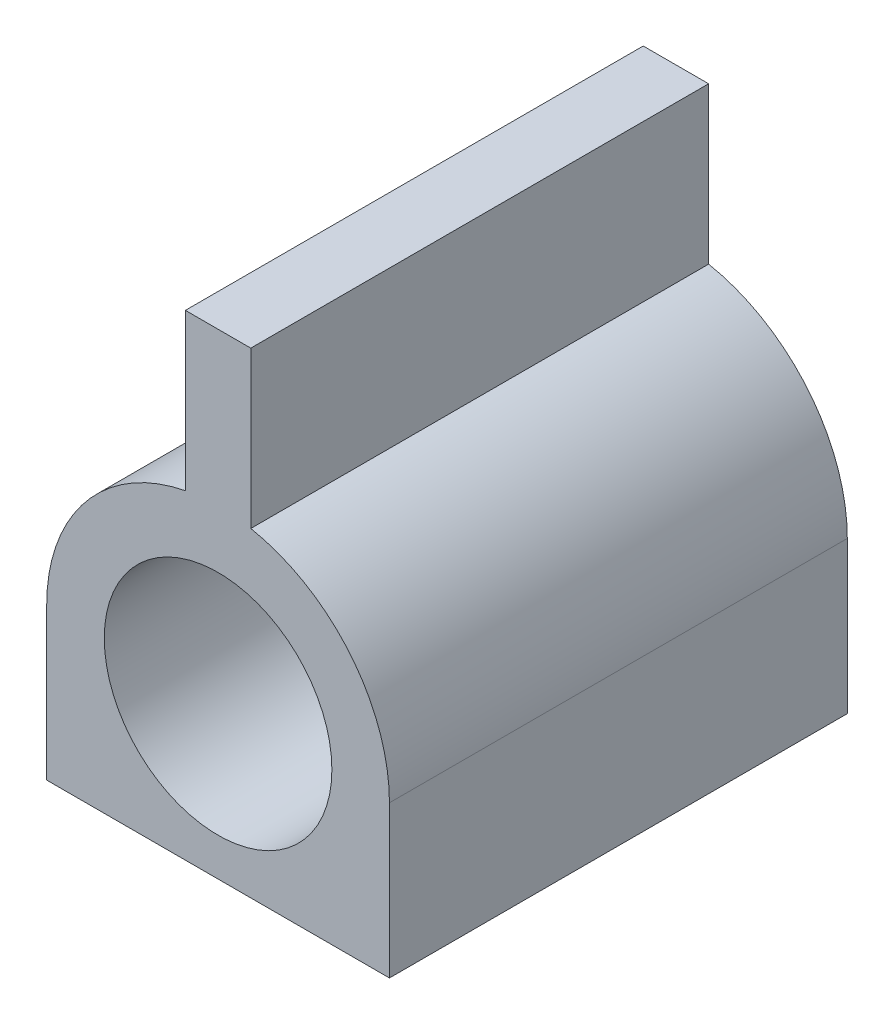
ISO-10303-21;
HEADER;
FILE_DESCRIPTION(('STEP AP214'),'2;1');
FILE_NAME('part.step','',(''),(''),'','','');
FILE_SCHEMA(('AUTOMOTIVE_DESIGN { 1 0 10303 214 1 1 1 1 }'));
ENDSEC;
DATA;
#1=APPLICATION_CONTEXT('core data for automotive mechanical design processes');
#2=APPLICATION_PROTOCOL_DEFINITION('international standard','automotive_design',2000,#1);
#3=PRODUCT_CONTEXT('',#1,'mechanical');
#4=PRODUCT('Part','Part','',(#3));
#5=PRODUCT_RELATED_PRODUCT_CATEGORY('part','',(#4));
#6=PRODUCT_DEFINITION_FORMATION('','',#4);
#7=PRODUCT_DEFINITION_CONTEXT('part definition',#1,'design');
#8=PRODUCT_DEFINITION('design','',#6,#7);
#9=PRODUCT_DEFINITION_SHAPE('','',#8);
#10=(LENGTH_UNIT() NAMED_UNIT(*) SI_UNIT(.MILLI.,.METRE.));
#11=(NAMED_UNIT(*) PLANE_ANGLE_UNIT() SI_UNIT($,.RADIAN.));
#12=(NAMED_UNIT(*) SI_UNIT($,.STERADIAN.) SOLID_ANGLE_UNIT());
#13=UNCERTAINTY_MEASURE_WITH_UNIT(LENGTH_MEASURE(1.E-05),#10,'distance_accuracy_value','');
#14=(GEOMETRIC_REPRESENTATION_CONTEXT(3) GLOBAL_UNCERTAINTY_ASSIGNED_CONTEXT((#13)) GLOBAL_UNIT_ASSIGNED_CONTEXT((#10,
#11,#12)) REPRESENTATION_CONTEXT('',''));
#15=CARTESIAN_POINT('',(0.,0.,0.));
#16=DIRECTION('',(0.,0.,1.));
#17=DIRECTION('',(1.,0.,0.));
#18=AXIS2_PLACEMENT_3D('',#15,#16,#17);
#19=CARTESIAN_POINT('',(0.,0.,22.225));
#20=DIRECTION('',(0.,0.,-1.));
#21=DIRECTION('',(-1.,0.,0.));
#22=AXIS2_PLACEMENT_3D('',#19,#20,#21);
#23=PLANE('',#22);
#24=DIRECTION('',(0.,-1.,0.));
#25=VECTOR('',#24,1.);
#26=CARTESIAN_POINT('',(-16.637,-14.732,22.225));
#27=LINE('',#26,#25);
#28=CARTESIAN_POINT('',(-16.637,0.,22.225));
#29=VERTEX_POINT('',#28);
#30=CARTESIAN_POINT('',(-16.637,-14.732,22.225));
#31=VERTEX_POINT('',#30);
#32=EDGE_CURVE('E146',#29,#31,#27,.T.);
#33=ORIENTED_EDGE('',*,*,#32,.T.);
#34=DIRECTION('',(1.,0.,0.));
#35=VECTOR('',#34,1.);
#36=CARTESIAN_POINT('',(16.637,-14.732,22.225));
#37=LINE('',#36,#35);
#38=CARTESIAN_POINT('',(16.637,-14.732,22.225));
#39=VERTEX_POINT('',#38);
#40=EDGE_CURVE('E94',#31,#39,#37,.T.);
#41=ORIENTED_EDGE('',*,*,#40,.T.);
#42=DIRECTION('',(0.,1.,0.));
#43=VECTOR('',#42,1.);
#44=CARTESIAN_POINT('',(16.637,0.,22.225));
#45=LINE('',#44,#43);
#46=CARTESIAN_POINT('',(16.637,0.,22.225));
#47=VERTEX_POINT('',#46);
#48=EDGE_CURVE('E161',#39,#47,#45,.T.);
#49=ORIENTED_EDGE('',*,*,#48,.T.);
#50=CARTESIAN_POINT('',(0.,0.,22.225));
#51=DIRECTION('',(0.,0.,1.));
#52=DIRECTION('',(-1.,0.,0.));
#53=AXIS2_PLACEMENT_3D('',#50,#51,#52);
#54=CIRCLE('',#53,16.637);
#55=CARTESIAN_POINT('',(3.175,16.3312321641694,22.225));
#56=VERTEX_POINT('',#55);
#57=EDGE_CURVE('E174',#47,#56,#54,.T.);
#58=ORIENTED_EDGE('',*,*,#57,.T.);
#59=DIRECTION('',(0.,1.,0.));
#60=VECTOR('',#59,1.);
#61=CARTESIAN_POINT('',(3.175,31.496,22.225));
#62=LINE('',#61,#60);
#63=CARTESIAN_POINT('',(3.175,31.496,22.225));
#64=VERTEX_POINT('',#63);
#65=EDGE_CURVE('E113',#56,#64,#62,.T.);
#66=ORIENTED_EDGE('',*,*,#65,.T.);
#67=DIRECTION('',(-1.,0.,0.));
#68=VECTOR('',#67,1.);
#69=CARTESIAN_POINT('',(-3.175,31.496,22.225));
#70=LINE('',#69,#68);
#71=CARTESIAN_POINT('',(-3.175,31.496,22.225));
#72=VERTEX_POINT('',#71);
#73=EDGE_CURVE('E107',#64,#72,#70,.T.);
#74=ORIENTED_EDGE('',*,*,#73,.T.);
#75=DIRECTION('',(0.,-1.,0.));
#76=VECTOR('',#75,1.);
#77=CARTESIAN_POINT('',(-3.175,16.3312321641694,22.225));
#78=LINE('',#77,#76);
#79=CARTESIAN_POINT('',(-3.175,16.3312321641694,22.225));
#80=VERTEX_POINT('',#79);
#81=EDGE_CURVE('E111',#72,#80,#78,.T.);
#82=ORIENTED_EDGE('',*,*,#81,.T.);
#83=CARTESIAN_POINT('',(0.,0.,22.225));
#84=DIRECTION('',(0.,0.,1.));
#85=DIRECTION('',(-1.,0.,0.));
#86=AXIS2_PLACEMENT_3D('',#83,#84,#85);
#87=CIRCLE('',#86,16.637);
#88=EDGE_CURVE('E51',#80,#29,#87,.T.);
#89=ORIENTED_EDGE('',*,*,#88,.T.);
#90=EDGE_LOOP('',(#33,#41,#49,#58,#66,#74,#82,#89));
#91=FACE_BOUND('',#90,.T.);
#92=CARTESIAN_POINT('',(0.,0.,22.225));
#93=DIRECTION('',(0.,0.,1.));
#94=DIRECTION('',(1.,0.,0.));
#95=AXIS2_PLACEMENT_3D('',#92,#93,#94);
#96=CIRCLE('',#95,11.049);
#97=CARTESIAN_POINT('',(11.049,0.,22.225));
#98=VERTEX_POINT('',#97);
#99=EDGE_CURVE('E135',#98,#98,#96,.T.);
#100=ORIENTED_EDGE('',*,*,#99,.F.);
#101=EDGE_LOOP('',(#100));
#102=FACE_BOUND('',#101,.T.);
#103=ADVANCED_FACE('F34',(#91,#102),#23,.F.);
#104=CARTESIAN_POINT('',(0.,0.,-22.225));
#105=DIRECTION('',(0.,0.,-1.));
#106=DIRECTION('',(-1.,0.,0.));
#107=AXIS2_PLACEMENT_3D('',#104,#105,#106);
#108=PLANE('',#107);
#109=DIRECTION('',(0.,-1.,0.));
#110=VECTOR('',#109,1.);
#111=CARTESIAN_POINT('',(-16.637,-14.732,-22.225));
#112=LINE('',#111,#110);
#113=CARTESIAN_POINT('',(-16.637,0.,-22.225));
#114=VERTEX_POINT('',#113);
#115=CARTESIAN_POINT('',(-16.637,-14.732,-22.225));
#116=VERTEX_POINT('',#115);
#117=EDGE_CURVE('E131',#114,#116,#112,.T.);
#118=ORIENTED_EDGE('',*,*,#117,.F.);
#119=CARTESIAN_POINT('',(0.,0.,-22.225));
#120=DIRECTION('',(0.,0.,1.));
#121=DIRECTION('',(-1.,0.,0.));
#122=AXIS2_PLACEMENT_3D('',#119,#120,#121);
#123=CIRCLE('',#122,16.637);
#124=CARTESIAN_POINT('',(-3.175,16.3312321641694,-22.225));
#125=VERTEX_POINT('',#124);
#126=EDGE_CURVE('E86',#125,#114,#123,.T.);
#127=ORIENTED_EDGE('',*,*,#126,.F.);
#128=DIRECTION('',(0.,-1.,0.));
#129=VECTOR('',#128,1.);
#130=CARTESIAN_POINT('',(-3.175,16.3312321641694,-22.225));
#131=LINE('',#130,#129);
#132=CARTESIAN_POINT('',(-3.175,31.496,-22.225));
#133=VERTEX_POINT('',#132);
#134=EDGE_CURVE('E80',#133,#125,#131,.T.);
#135=ORIENTED_EDGE('',*,*,#134,.F.);
#136=DIRECTION('',(-1.,0.,0.));
#137=VECTOR('',#136,1.);
#138=CARTESIAN_POINT('',(-3.175,31.496,-22.225));
#139=LINE('',#138,#137);
#140=CARTESIAN_POINT('',(3.175,31.496,-22.225));
#141=VERTEX_POINT('',#140);
#142=EDGE_CURVE('E121',#141,#133,#139,.T.);
#143=ORIENTED_EDGE('',*,*,#142,.F.);
#144=DIRECTION('',(0.,1.,0.));
#145=VECTOR('',#144,1.);
#146=CARTESIAN_POINT('',(3.175,31.496,-22.225));
#147=LINE('',#146,#145);
#148=CARTESIAN_POINT('',(3.175,16.3312321641694,-22.225));
#149=VERTEX_POINT('',#148);
#150=EDGE_CURVE('E141',#149,#141,#147,.T.);
#151=ORIENTED_EDGE('',*,*,#150,.F.);
#152=CARTESIAN_POINT('',(0.,0.,-22.225));
#153=DIRECTION('',(0.,0.,1.));
#154=DIRECTION('',(-1.,0.,0.));
#155=AXIS2_PLACEMENT_3D('',#152,#153,#154);
#156=CIRCLE('',#155,16.637);
#157=CARTESIAN_POINT('',(16.637,0.,-22.225));
#158=VERTEX_POINT('',#157);
#159=EDGE_CURVE('E139',#158,#149,#156,.T.);
#160=ORIENTED_EDGE('',*,*,#159,.F.);
#161=DIRECTION('',(0.,1.,0.));
#162=VECTOR('',#161,1.);
#163=CARTESIAN_POINT('',(16.637,0.,-22.225));
#164=LINE('',#163,#162);
#165=CARTESIAN_POINT('',(16.637,-14.732,-22.225));
#166=VERTEX_POINT('',#165);
#167=EDGE_CURVE('E137',#166,#158,#164,.T.);
#168=ORIENTED_EDGE('',*,*,#167,.F.);
#169=DIRECTION('',(1.,0.,0.));
#170=VECTOR('',#169,1.);
#171=CARTESIAN_POINT('',(16.637,-14.732,-22.225));
#172=LINE('',#171,#170);
#173=EDGE_CURVE('E134',#116,#166,#172,.T.);
#174=ORIENTED_EDGE('',*,*,#173,.F.);
#175=EDGE_LOOP('',(#118,#127,#135,#143,#151,#160,#168,#174));
#176=FACE_BOUND('',#175,.T.);
#177=CARTESIAN_POINT('',(0.,0.,-22.225));
#178=DIRECTION('',(0.,0.,1.));
#179=DIRECTION('',(1.,0.,0.));
#180=AXIS2_PLACEMENT_3D('',#177,#178,#179);
#181=CIRCLE('',#180,11.049);
#182=CARTESIAN_POINT('',(11.049,0.,-22.225));
#183=VERTEX_POINT('',#182);
#184=EDGE_CURVE('E180',#183,#183,#181,.T.);
#185=ORIENTED_EDGE('',*,*,#184,.T.);
#186=EDGE_LOOP('',(#185));
#187=FACE_BOUND('',#186,.T.);
#188=ADVANCED_FACE('F165',(#176,#187),#108,.T.);
#189=CARTESIAN_POINT('',(-16.637,-14.732,22.225));
#190=DIRECTION('',(1.,0.,0.));
#191=DIRECTION('',(0.,0.,-1.));
#192=AXIS2_PLACEMENT_3D('',#189,#190,#191);
#193=PLANE('',#192);
#194=ORIENTED_EDGE('',*,*,#117,.T.);
#195=DIRECTION('',(0.,0.,-1.));
#196=VECTOR('',#195,1.);
#197=CARTESIAN_POINT('',(-16.637,-14.732,22.225));
#198=LINE('',#197,#196);
#199=EDGE_CURVE('E11',#31,#116,#198,.T.);
#200=ORIENTED_EDGE('',*,*,#199,.F.);
#201=ORIENTED_EDGE('',*,*,#32,.F.);
#202=DIRECTION('',(0.,0.,-1.));
#203=VECTOR('',#202,1.);
#204=CARTESIAN_POINT('',(-16.637,0.,22.225));
#205=LINE('',#204,#203);
#206=EDGE_CURVE('E127',#29,#114,#205,.T.);
#207=ORIENTED_EDGE('',*,*,#206,.T.);
#208=EDGE_LOOP('',(#194,#200,#201,#207));
#209=FACE_BOUND('',#208,.T.);
#210=ADVANCED_FACE('F36',(#209),#193,.F.);
#211=CARTESIAN_POINT('',(16.637,-14.732,22.225));
#212=DIRECTION('',(0.,1.,0.));
#213=DIRECTION('',(-1.,0.,0.));
#214=AXIS2_PLACEMENT_3D('',#211,#212,#213);
#215=PLANE('',#214);
#216=ORIENTED_EDGE('',*,*,#173,.T.);
#217=DIRECTION('',(0.,0.,-1.));
#218=VECTOR('',#217,1.);
#219=CARTESIAN_POINT('',(16.637,-14.732,22.225));
#220=LINE('',#219,#218);
#221=EDGE_CURVE('E43',#39,#166,#220,.T.);
#222=ORIENTED_EDGE('',*,*,#221,.F.);
#223=ORIENTED_EDGE('',*,*,#40,.F.);
#224=ORIENTED_EDGE('',*,*,#199,.T.);
#225=EDGE_LOOP('',(#216,#222,#223,#224));
#226=FACE_BOUND('',#225,.T.);
#227=ADVANCED_FACE('F208',(#226),#215,.F.);
#228=CARTESIAN_POINT('',(16.637,0.,22.225));
#229=DIRECTION('',(-1.,0.,0.));
#230=DIRECTION('',(0.,-1.,0.));
#231=AXIS2_PLACEMENT_3D('',#228,#229,#230);
#232=PLANE('',#231);
#233=ORIENTED_EDGE('',*,*,#167,.T.);
#234=DIRECTION('',(0.,0.,-1.));
#235=VECTOR('',#234,1.);
#236=CARTESIAN_POINT('',(16.637,0.,22.225));
#237=LINE('',#236,#235);
#238=EDGE_CURVE('E153',#47,#158,#237,.T.);
#239=ORIENTED_EDGE('',*,*,#238,.F.);
#240=ORIENTED_EDGE('',*,*,#48,.F.);
#241=ORIENTED_EDGE('',*,*,#221,.T.);
#242=EDGE_LOOP('',(#233,#239,#240,#241));
#243=FACE_BOUND('',#242,.T.);
#244=ADVANCED_FACE('F159',(#243),#232,.F.);
#245=CARTESIAN_POINT('',(0.,0.,22.225));
#246=DIRECTION('',(0.,0.,-1.));
#247=DIRECTION('',(-1.,0.,0.));
#248=AXIS2_PLACEMENT_3D('',#245,#246,#247);
#249=CYLINDRICAL_SURFACE('',#248,16.637);
#250=ORIENTED_EDGE('',*,*,#159,.T.);
#251=DIRECTION('',(0.,0.,-1.));
#252=VECTOR('',#251,1.);
#253=CARTESIAN_POINT('',(3.175,16.3312321641694,22.225));
#254=LINE('',#253,#252);
#255=EDGE_CURVE('E150',#56,#149,#254,.T.);
#256=ORIENTED_EDGE('',*,*,#255,.F.);
#257=ORIENTED_EDGE('',*,*,#57,.F.);
#258=ORIENTED_EDGE('',*,*,#238,.T.);
#259=EDGE_LOOP('',(#250,#256,#257,#258));
#260=FACE_BOUND('',#259,.T.);
#261=ADVANCED_FACE('F170',(#260),#249,.T.);
#262=CARTESIAN_POINT('',(3.175,31.496,22.225));
#263=DIRECTION('',(-1.,0.,0.));
#264=DIRECTION('',(0.,-1.,0.));
#265=AXIS2_PLACEMENT_3D('',#262,#263,#264);
#266=PLANE('',#265);
#267=ORIENTED_EDGE('',*,*,#150,.T.);
#268=DIRECTION('',(0.,0.,-1.));
#269=VECTOR('',#268,1.);
#270=CARTESIAN_POINT('',(3.175,31.496,22.225));
#271=LINE('',#270,#269);
#272=EDGE_CURVE('E122',#64,#141,#271,.T.);
#273=ORIENTED_EDGE('',*,*,#272,.F.);
#274=ORIENTED_EDGE('',*,*,#65,.F.);
#275=ORIENTED_EDGE('',*,*,#255,.T.);
#276=EDGE_LOOP('',(#267,#273,#274,#275));
#277=FACE_BOUND('',#276,.T.);
#278=ADVANCED_FACE('F173',(#277),#266,.F.);
#279=CARTESIAN_POINT('',(-3.175,31.496,22.225));
#280=DIRECTION('',(0.,-1.,0.));
#281=DIRECTION('',(0.,0.,-1.));
#282=AXIS2_PLACEMENT_3D('',#279,#280,#281);
#283=PLANE('',#282);
#284=ORIENTED_EDGE('',*,*,#142,.T.);
#285=DIRECTION('',(0.,0.,-1.));
#286=VECTOR('',#285,1.);
#287=CARTESIAN_POINT('',(-3.175,31.496,22.225));
#288=LINE('',#287,#286);
#289=EDGE_CURVE('E118',#72,#133,#288,.T.);
#290=ORIENTED_EDGE('',*,*,#289,.F.);
#291=ORIENTED_EDGE('',*,*,#73,.F.);
#292=ORIENTED_EDGE('',*,*,#272,.T.);
#293=EDGE_LOOP('',(#284,#290,#291,#292));
#294=FACE_BOUND('',#293,.T.);
#295=ADVANCED_FACE('F119',(#294),#283,.F.);
#296=CARTESIAN_POINT('',(-3.175,16.3312321641694,22.225));
#297=DIRECTION('',(1.,0.,0.));
#298=DIRECTION('',(0.,1.,0.));
#299=AXIS2_PLACEMENT_3D('',#296,#297,#298);
#300=PLANE('',#299);
#301=ORIENTED_EDGE('',*,*,#134,.T.);
#302=DIRECTION('',(0.,0.,-1.));
#303=VECTOR('',#302,1.);
#304=CARTESIAN_POINT('',(-3.175,16.3312321641694,22.225));
#305=LINE('',#304,#303);
#306=EDGE_CURVE('E123',#80,#125,#305,.T.);
#307=ORIENTED_EDGE('',*,*,#306,.F.);
#308=ORIENTED_EDGE('',*,*,#81,.F.);
#309=ORIENTED_EDGE('',*,*,#289,.T.);
#310=EDGE_LOOP('',(#301,#307,#308,#309));
#311=FACE_BOUND('',#310,.T.);
#312=ADVANCED_FACE('F125',(#311),#300,.F.);
#313=CARTESIAN_POINT('',(0.,0.,22.225));
#314=DIRECTION('',(0.,0.,-1.));
#315=DIRECTION('',(-1.,0.,0.));
#316=AXIS2_PLACEMENT_3D('',#313,#314,#315);
#317=CYLINDRICAL_SURFACE('',#316,16.637);
#318=ORIENTED_EDGE('',*,*,#126,.T.);
#319=ORIENTED_EDGE('',*,*,#206,.F.);
#320=ORIENTED_EDGE('',*,*,#88,.F.);
#321=ORIENTED_EDGE('',*,*,#306,.T.);
#322=EDGE_LOOP('',(#318,#319,#320,#321));
#323=FACE_BOUND('',#322,.T.);
#324=ADVANCED_FACE('F196',(#323),#317,.T.);
#325=CARTESIAN_POINT('',(0.,0.,22.225));
#326=DIRECTION('',(0.,0.,-1.));
#327=DIRECTION('',(-1.,0.,0.));
#328=AXIS2_PLACEMENT_3D('',#325,#326,#327);
#329=CYLINDRICAL_SURFACE('',#328,11.049);
#330=ORIENTED_EDGE('',*,*,#99,.T.);
#331=EDGE_LOOP('',(#330));
#332=FACE_BOUND('',#331,.T.);
#333=ORIENTED_EDGE('',*,*,#184,.F.);
#334=EDGE_LOOP('',(#333));
#335=FACE_BOUND('',#334,.T.);
#336=ADVANCED_FACE('F186',(#332,#335),#329,.F.);
#337=CLOSED_SHELL('',(#103,#188,#210,#227,#244,#261,#278,#295,#312,#324,#336));
#338=MANIFOLD_SOLID_BREP('B2',#337);
#339=ADVANCED_BREP_SHAPE_REPRESENTATION('',(#18,#338),#14);
#340=SHAPE_DEFINITION_REPRESENTATION(#9,#339);
ENDSEC;
END-ISO-10303-21;
